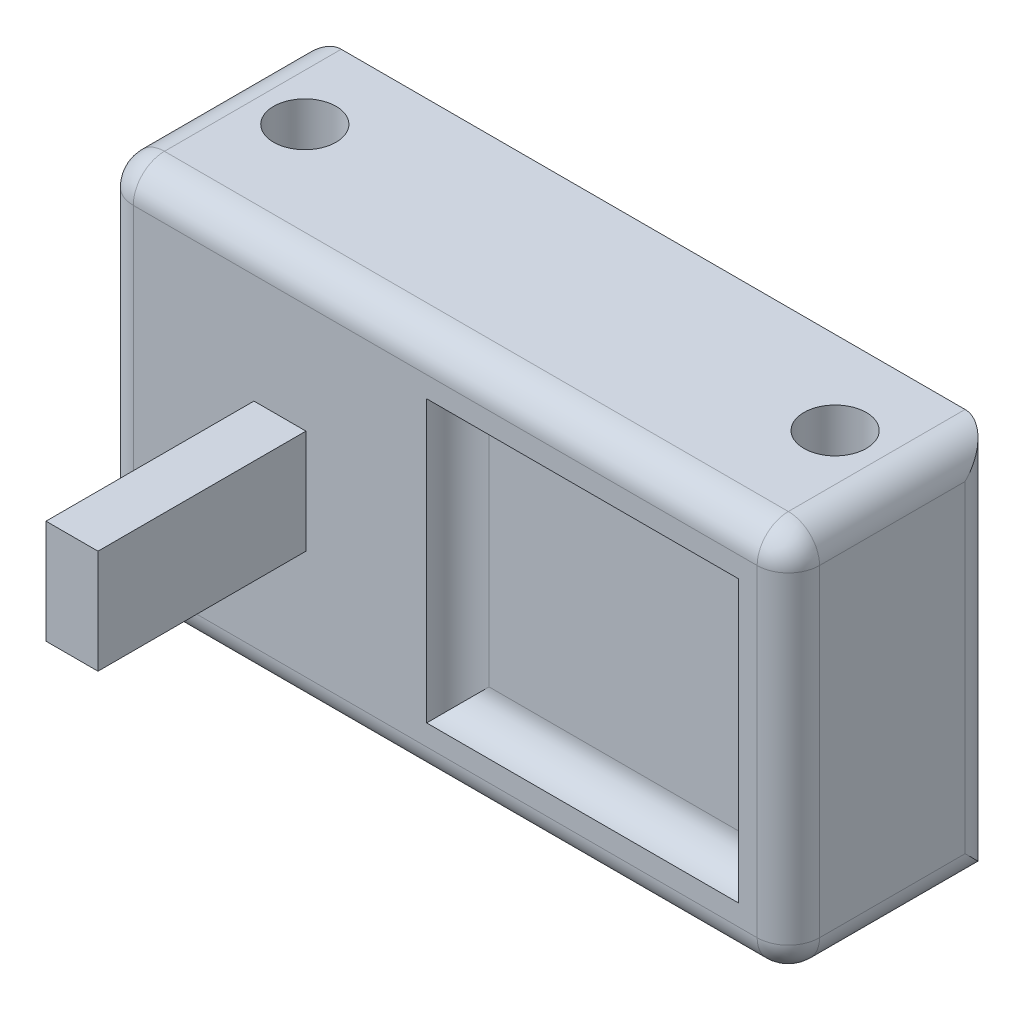
ISO-10303-21;
HEADER;
FILE_DESCRIPTION(('STEP AP214'),'2;1');
FILE_NAME('part.step','',(''),(''),'','','');
FILE_SCHEMA(('AUTOMOTIVE_DESIGN { 1 0 10303 214 1 1 1 1 }'));
ENDSEC;
DATA;
#1=APPLICATION_CONTEXT('core data for automotive mechanical design processes');
#2=APPLICATION_PROTOCOL_DEFINITION('international standard','automotive_design',2000,#1);
#3=PRODUCT_CONTEXT('',#1,'mechanical');
#4=PRODUCT('Part','Part','',(#3));
#5=PRODUCT_RELATED_PRODUCT_CATEGORY('part','',(#4));
#6=PRODUCT_DEFINITION_FORMATION('','',#4);
#7=PRODUCT_DEFINITION_CONTEXT('part definition',#1,'design');
#8=PRODUCT_DEFINITION('design','',#6,#7);
#9=PRODUCT_DEFINITION_SHAPE('','',#8);
#10=(LENGTH_UNIT() NAMED_UNIT(*) SI_UNIT(.MILLI.,.METRE.));
#11=(NAMED_UNIT(*) PLANE_ANGLE_UNIT() SI_UNIT($,.RADIAN.));
#12=(NAMED_UNIT(*) SI_UNIT($,.STERADIAN.) SOLID_ANGLE_UNIT());
#13=UNCERTAINTY_MEASURE_WITH_UNIT(LENGTH_MEASURE(1.E-05),#10,'distance_accuracy_value','');
#14=(GEOMETRIC_REPRESENTATION_CONTEXT(3) GLOBAL_UNCERTAINTY_ASSIGNED_CONTEXT((#13)) GLOBAL_UNIT_ASSIGNED_CONTEXT((#10,
#11,#12)) REPRESENTATION_CONTEXT('',''));
#15=CARTESIAN_POINT('',(0.,0.,0.));
#16=DIRECTION('',(0.,0.,1.));
#17=DIRECTION('',(1.,0.,0.));
#18=AXIS2_PLACEMENT_3D('',#15,#16,#17);
#19=CARTESIAN_POINT('',(0.,0.,200.));
#20=DIRECTION('',(0.,0.,1.));
#21=DIRECTION('',(1.,0.,0.));
#22=AXIS2_PLACEMENT_3D('',#19,#20,#21);
#23=PLANE('',#22);
#24=DIRECTION('',(0.,-1.,0.));
#25=VECTOR('',#24,1.);
#26=CARTESIAN_POINT('',(-66.2823811220889,125.374251497006,200.));
#27=LINE('',#26,#25);
#28=CARTESIAN_POINT('',(-66.2823811220889,125.374251497006,200.));
#29=VERTEX_POINT('',#28);
#30=CARTESIAN_POINT('',(-66.2823811220889,-144.625748502994,200.));
#31=VERTEX_POINT('',#30);
#32=EDGE_CURVE('E195',#29,#31,#27,.T.);
#33=ORIENTED_EDGE('',*,*,#32,.F.);
#34=DIRECTION('',(-1.,0.,0.));
#35=VECTOR('',#34,1.);
#36=CARTESIAN_POINT('',(-66.2823811220889,125.374251497006,200.));
#37=LINE('',#36,#35);
#38=CARTESIAN_POINT('',(233.717618877911,125.374251497006,200.));
#39=VERTEX_POINT('',#38);
#40=EDGE_CURVE('E204',#39,#29,#37,.T.);
#41=ORIENTED_EDGE('',*,*,#40,.F.);
#42=DIRECTION('',(0.,1.,0.));
#43=VECTOR('',#42,1.);
#44=CARTESIAN_POINT('',(233.717618877911,125.374251497006,200.));
#45=LINE('',#44,#43);
#46=CARTESIAN_POINT('',(233.717618877911,-144.625748502994,200.));
#47=VERTEX_POINT('',#46);
#48=EDGE_CURVE('E201',#47,#39,#45,.T.);
#49=ORIENTED_EDGE('',*,*,#48,.F.);
#50=DIRECTION('',(1.,0.,0.));
#51=VECTOR('',#50,1.);
#52=CARTESIAN_POINT('',(-66.2823811220889,-144.625748502994,200.));
#53=LINE('',#52,#51);
#54=EDGE_CURVE('E198',#31,#47,#53,.T.);
#55=ORIENTED_EDGE('',*,*,#54,.F.);
#56=EDGE_LOOP('',(#33,#41,#49,#55));
#57=FACE_BOUND('',#56,.T.);
#58=DIRECTION('',(-1.,0.,0.));
#59=VECTOR('',#58,1.);
#60=CARTESIAN_POINT('',(-378.456705785911,145.374251497006,200.));
#61=LINE('',#60,#59);
#62=CARTESIAN_POINT('',(251.54329421409,145.374251497006,200.));
#63=VERTEX_POINT('',#62);
#64=CARTESIAN_POINT('',(-348.45670578591,145.374251497006,200.));
#65=VERTEX_POINT('',#64);
#66=EDGE_CURVE('E245',#63,#65,#61,.T.);
#67=ORIENTED_EDGE('',*,*,#66,.T.);
#68=DIRECTION('',(0.,-1.,0.));
#69=VECTOR('',#68,1.);
#70=CARTESIAN_POINT('',(-348.45670578591,-194.625748502994,200.));
#71=LINE('',#70,#69);
#72=CARTESIAN_POINT('',(-348.45670578591,-164.625748502994,200.));
#73=VERTEX_POINT('',#72);
#74=EDGE_CURVE('E249',#65,#73,#71,.T.);
#75=ORIENTED_EDGE('',*,*,#74,.T.);
#76=DIRECTION('',(1.,0.,0.));
#77=VECTOR('',#76,1.);
#78=CARTESIAN_POINT('',(281.54329421409,-164.625748502994,200.));
#79=LINE('',#78,#77);
#80=CARTESIAN_POINT('',(251.54329421409,-164.625748502994,200.));
#81=VERTEX_POINT('',#80);
#82=EDGE_CURVE('E247',#73,#81,#79,.T.);
#83=ORIENTED_EDGE('',*,*,#82,.T.);
#84=DIRECTION('',(0.,1.,0.));
#85=VECTOR('',#84,1.);
#86=CARTESIAN_POINT('',(251.54329421409,175.374251497006,200.));
#87=LINE('',#86,#85);
#88=EDGE_CURVE('E243',#81,#63,#87,.T.);
#89=ORIENTED_EDGE('',*,*,#88,.T.);
#90=EDGE_LOOP('',(#67,#75,#83,#89));
#91=FACE_BOUND('',#90,.T.);
#92=DIRECTION('',(-1.,0.,0.));
#93=VECTOR('',#92,1.);
#94=CARTESIAN_POINT('',(-232.369543454,40.3742514970061,200.));
#95=LINE('',#94,#93);
#96=CARTESIAN_POINT('',(-182.369543454,40.3742514970061,200.));
#97=VERTEX_POINT('',#96);
#98=CARTESIAN_POINT('',(-232.369543454,40.3742514970061,200.));
#99=VERTEX_POINT('',#98);
#100=EDGE_CURVE('E683',#97,#99,#95,.T.);
#101=ORIENTED_EDGE('',*,*,#100,.F.);
#102=DIRECTION('',(0.,1.,0.));
#103=VECTOR('',#102,1.);
#104=CARTESIAN_POINT('',(-182.369543454,-59.6257485029939,200.));
#105=LINE('',#104,#103);
#106=CARTESIAN_POINT('',(-182.369543454,-59.6257485029939,200.));
#107=VERTEX_POINT('',#106);
#108=EDGE_CURVE('E186',#107,#97,#105,.T.);
#109=ORIENTED_EDGE('',*,*,#108,.F.);
#110=DIRECTION('',(1.,0.,0.));
#111=VECTOR('',#110,1.);
#112=CARTESIAN_POINT('',(-232.369543454,-59.6257485029939,200.));
#113=LINE('',#112,#111);
#114=CARTESIAN_POINT('',(-232.369543454,-59.6257485029939,200.));
#115=VERTEX_POINT('',#114);
#116=EDGE_CURVE('E182',#115,#107,#113,.T.);
#117=ORIENTED_EDGE('',*,*,#116,.F.);
#118=DIRECTION('',(0.,-1.,0.));
#119=VECTOR('',#118,1.);
#120=CARTESIAN_POINT('',(-232.369543454,-59.6257485029939,200.));
#121=LINE('',#120,#119);
#122=EDGE_CURVE('E685',#99,#115,#121,.T.);
#123=ORIENTED_EDGE('',*,*,#122,.F.);
#124=EDGE_LOOP('',(#101,#109,#117,#123));
#125=FACE_BOUND('',#124,.T.);
#126=ADVANCED_FACE('F37',(#57,#91,#125),#23,.T.);
#127=CARTESIAN_POINT('',(-378.456705785911,175.374251497006,200.));
#128=DIRECTION('',(1.,0.,0.));
#129=DIRECTION('',(0.,1.,0.));
#130=AXIS2_PLACEMENT_3D('',#127,#128,#129);
#131=PLANE('',#130);
#132=DIRECTION('',(0.,-1.,0.));
#133=VECTOR('',#132,1.);
#134=CARTESIAN_POINT('',(-378.456705785911,175.374251497006,170.));
#135=LINE('',#134,#133);
#136=CARTESIAN_POINT('',(-378.45670578591,-164.625748502994,170.));
#137=VERTEX_POINT('',#136);
#138=CARTESIAN_POINT('',(-378.456705785911,145.374251497006,170.));
#139=VERTEX_POINT('',#138);
#140=EDGE_CURVE('E231',#137,#139,#135,.F.);
#141=ORIENTED_EDGE('',*,*,#140,.T.);
#142=DIRECTION('',(0.,0.,-1.));
#143=VECTOR('',#142,1.);
#144=CARTESIAN_POINT('',(-378.456705785911,145.374251497006,200.));
#145=LINE('',#144,#143);
#146=CARTESIAN_POINT('',(-378.456705785911,145.374251497006,30.));
#147=VERTEX_POINT('',#146);
#148=EDGE_CURVE('E233',#139,#147,#145,.T.);
#149=ORIENTED_EDGE('',*,*,#148,.T.);
#150=DIRECTION('',(0.,-1.,0.));
#151=VECTOR('',#150,1.);
#152=CARTESIAN_POINT('',(-378.456705785911,175.374251497006,30.));
#153=LINE('',#152,#151);
#154=CARTESIAN_POINT('',(-378.45670578591,-164.625748502994,30.));
#155=VERTEX_POINT('',#154);
#156=EDGE_CURVE('E227',#147,#155,#153,.T.);
#157=ORIENTED_EDGE('',*,*,#156,.T.);
#158=DIRECTION('',(0.,0.,-1.));
#159=VECTOR('',#158,1.);
#160=CARTESIAN_POINT('',(-378.45670578591,-164.625748502994,200.));
#161=LINE('',#160,#159);
#162=EDGE_CURVE('E229',#155,#137,#161,.F.);
#163=ORIENTED_EDGE('',*,*,#162,.T.);
#164=EDGE_LOOP('',(#141,#149,#157,#163));
#165=FACE_BOUND('',#164,.T.);
#166=ADVANCED_FACE('F352',(#165),#131,.F.);
#167=CARTESIAN_POINT('',(-378.45670578591,-194.625748502994,200.));
#168=DIRECTION('',(0.,1.,0.));
#169=DIRECTION('',(0.,0.,1.));
#170=AXIS2_PLACEMENT_3D('',#167,#168,#169);
#171=PLANE('',#170);
#172=CARTESIAN_POINT('',(-303.45670578591,-194.625748502994,80.));
#173=DIRECTION('',(0.,-1.,0.));
#174=DIRECTION('',(0.,0.,-1.));
#175=AXIS2_PLACEMENT_3D('',#172,#173,#174);
#176=CIRCLE('',#175,30.);
#177=CARTESIAN_POINT('',(-303.45670578591,-194.625748502994,50.));
#178=VERTEX_POINT('',#177);
#179=EDGE_CURVE('E212',#178,#178,#176,.T.);
#180=ORIENTED_EDGE('',*,*,#179,.F.);
#181=EDGE_LOOP('',(#180));
#182=FACE_BOUND('',#181,.T.);
#183=CARTESIAN_POINT('',(206.54329421409,-194.625748502994,80.));
#184=DIRECTION('',(0.,-1.,0.));
#185=DIRECTION('',(0.,0.,-1.));
#186=AXIS2_PLACEMENT_3D('',#183,#184,#185);
#187=CIRCLE('',#186,30.);
#188=CARTESIAN_POINT('',(206.54329421409,-194.625748502994,50.));
#189=VERTEX_POINT('',#188);
#190=EDGE_CURVE('E218',#189,#189,#187,.T.);
#191=ORIENTED_EDGE('',*,*,#190,.F.);
#192=EDGE_LOOP('',(#191));
#193=FACE_BOUND('',#192,.T.);
#194=DIRECTION('',(1.,0.,0.));
#195=VECTOR('',#194,1.);
#196=CARTESIAN_POINT('',(-378.45670578591,-194.625748502994,170.));
#197=LINE('',#196,#195);
#198=CARTESIAN_POINT('',(251.54329421409,-194.625748502994,170.));
#199=VERTEX_POINT('',#198);
#200=CARTESIAN_POINT('',(-348.45670578591,-194.625748502994,170.));
#201=VERTEX_POINT('',#200);
#202=EDGE_CURVE('E252',#199,#201,#197,.F.);
#203=ORIENTED_EDGE('',*,*,#202,.T.);
#204=DIRECTION('',(0.,0.,-1.));
#205=VECTOR('',#204,1.);
#206=CARTESIAN_POINT('',(-348.45670578591,-194.625748502994,200.));
#207=LINE('',#206,#205);
#208=CARTESIAN_POINT('',(-348.45670578591,-194.625748502994,0.));
#209=VERTEX_POINT('',#208);
#210=EDGE_CURVE('E256',#201,#209,#207,.T.);
#211=ORIENTED_EDGE('',*,*,#210,.T.);
#212=DIRECTION('',(1.,0.,0.));
#213=VECTOR('',#212,1.);
#214=CARTESIAN_POINT('',(-378.45670578591,-194.625748502994,0.));
#215=LINE('',#214,#213);
#216=CARTESIAN_POINT('',(251.54329421409,-194.625748502994,0.));
#217=VERTEX_POINT('',#216);
#218=EDGE_CURVE('E211',#209,#217,#215,.T.);
#219=ORIENTED_EDGE('',*,*,#218,.T.);
#220=DIRECTION('',(0.,0.,-1.));
#221=VECTOR('',#220,1.);
#222=CARTESIAN_POINT('',(251.54329421409,-194.625748502994,200.));
#223=LINE('',#222,#221);
#224=EDGE_CURVE('E254',#217,#199,#223,.F.);
#225=ORIENTED_EDGE('',*,*,#224,.T.);
#226=EDGE_LOOP('',(#203,#211,#219,#225));
#227=FACE_BOUND('',#226,.T.);
#228=ADVANCED_FACE('F357',(#182,#193,#227),#171,.F.);
#229=CARTESIAN_POINT('',(281.54329421409,175.374251497006,200.));
#230=DIRECTION('',(-1.,0.,0.));
#231=DIRECTION('',(0.,0.,1.));
#232=AXIS2_PLACEMENT_3D('',#229,#230,#231);
#233=PLANE('',#232);
#234=DIRECTION('',(0.,0.,-1.));
#235=VECTOR('',#234,1.);
#236=CARTESIAN_POINT('',(281.54329421409,-164.625748502994,200.));
#237=LINE('',#236,#235);
#238=CARTESIAN_POINT('',(281.54329421409,-164.625748502994,170.));
#239=VERTEX_POINT('',#238);
#240=CARTESIAN_POINT('',(281.54329421409,-164.625748502994,30.));
#241=VERTEX_POINT('',#240);
#242=EDGE_CURVE('E266',#239,#241,#237,.T.);
#243=ORIENTED_EDGE('',*,*,#242,.T.);
#244=DIRECTION('',(0.,1.,0.));
#245=VECTOR('',#244,1.);
#246=CARTESIAN_POINT('',(281.54329421409,175.374251497006,30.));
#247=LINE('',#246,#245);
#248=CARTESIAN_POINT('',(281.54329421409,145.374251497006,30.));
#249=VERTEX_POINT('',#248);
#250=EDGE_CURVE('E269',#241,#249,#247,.T.);
#251=ORIENTED_EDGE('',*,*,#250,.T.);
#252=DIRECTION('',(0.,0.,-1.));
#253=VECTOR('',#252,1.);
#254=CARTESIAN_POINT('',(281.54329421409,145.374251497006,200.));
#255=LINE('',#254,#253);
#256=CARTESIAN_POINT('',(281.54329421409,145.374251497006,170.));
#257=VERTEX_POINT('',#256);
#258=EDGE_CURVE('E264',#249,#257,#255,.F.);
#259=ORIENTED_EDGE('',*,*,#258,.T.);
#260=DIRECTION('',(0.,1.,0.));
#261=VECTOR('',#260,1.);
#262=CARTESIAN_POINT('',(281.54329421409,-194.625748502994,170.));
#263=LINE('',#262,#261);
#264=EDGE_CURVE('E262',#257,#239,#263,.F.);
#265=ORIENTED_EDGE('',*,*,#264,.T.);
#266=EDGE_LOOP('',(#243,#251,#259,#265));
#267=FACE_BOUND('',#266,.T.);
#268=ADVANCED_FACE('F370',(#267),#233,.F.);
#269=CARTESIAN_POINT('',(-378.456705785911,175.374251497006,200.));
#270=DIRECTION('',(0.,-1.,0.));
#271=DIRECTION('',(0.,0.,-1.));
#272=AXIS2_PLACEMENT_3D('',#269,#270,#271);
#273=PLANE('',#272);
#274=DIRECTION('',(-1.,0.,0.));
#275=VECTOR('',#274,1.);
#276=CARTESIAN_POINT('',(-378.456705785911,175.374251497006,0.));
#277=LINE('',#276,#275);
#278=CARTESIAN_POINT('',(251.54329421409,175.374251497006,0.));
#279=VERTEX_POINT('',#278);
#280=CARTESIAN_POINT('',(-348.45670578591,175.374251497006,0.));
#281=VERTEX_POINT('',#280);
#282=EDGE_CURVE('E224',#279,#281,#277,.T.);
#283=ORIENTED_EDGE('',*,*,#282,.T.);
#284=DIRECTION('',(0.,0.,-1.));
#285=VECTOR('',#284,1.);
#286=CARTESIAN_POINT('',(-348.45670578591,175.374251497006,200.));
#287=LINE('',#286,#285);
#288=CARTESIAN_POINT('',(-348.45670578591,175.374251497006,170.));
#289=VERTEX_POINT('',#288);
#290=EDGE_CURVE('E240',#281,#289,#287,.F.);
#291=ORIENTED_EDGE('',*,*,#290,.T.);
#292=DIRECTION('',(-1.,0.,0.));
#293=VECTOR('',#292,1.);
#294=CARTESIAN_POINT('',(281.54329421409,175.374251497006,170.));
#295=LINE('',#294,#293);
#296=CARTESIAN_POINT('',(251.54329421409,175.374251497006,170.));
#297=VERTEX_POINT('',#296);
#298=EDGE_CURVE('E236',#289,#297,#295,.F.);
#299=ORIENTED_EDGE('',*,*,#298,.T.);
#300=DIRECTION('',(0.,0.,-1.));
#301=VECTOR('',#300,1.);
#302=CARTESIAN_POINT('',(251.54329421409,175.374251497006,200.));
#303=LINE('',#302,#301);
#304=EDGE_CURVE('E238',#297,#279,#303,.T.);
#305=ORIENTED_EDGE('',*,*,#304,.T.);
#306=EDGE_LOOP('',(#283,#291,#299,#305));
#307=FACE_BOUND('',#306,.T.);
#308=CARTESIAN_POINT('',(-303.45670578591,175.374251497006,80.));
#309=DIRECTION('',(0.,-1.,0.));
#310=DIRECTION('',(0.,0.,-1.));
#311=AXIS2_PLACEMENT_3D('',#308,#309,#310);
#312=CIRCLE('',#311,30.);
#313=CARTESIAN_POINT('',(-303.45670578591,175.374251497006,50.));
#314=VERTEX_POINT('',#313);
#315=EDGE_CURVE('E208',#314,#314,#312,.T.);
#316=ORIENTED_EDGE('',*,*,#315,.T.);
#317=EDGE_LOOP('',(#316));
#318=FACE_BOUND('',#317,.T.);
#319=CARTESIAN_POINT('',(206.54329421409,175.374251497006,80.));
#320=DIRECTION('',(0.,-1.,0.));
#321=DIRECTION('',(0.,0.,-1.));
#322=AXIS2_PLACEMENT_3D('',#319,#320,#321);
#323=CIRCLE('',#322,30.);
#324=CARTESIAN_POINT('',(206.54329421409,175.374251497006,50.));
#325=VERTEX_POINT('',#324);
#326=EDGE_CURVE('E215',#325,#325,#323,.T.);
#327=ORIENTED_EDGE('',*,*,#326,.T.);
#328=EDGE_LOOP('',(#327));
#329=FACE_BOUND('',#328,.T.);
#330=ADVANCED_FACE('F366',(#307,#318,#329),#273,.F.);
#331=CARTESIAN_POINT('',(0.,0.,0.));
#332=DIRECTION('',(0.,0.,1.));
#333=DIRECTION('',(1.,0.,0.));
#334=AXIS2_PLACEMENT_3D('',#331,#332,#333);
#335=PLANE('',#334);
#336=ORIENTED_EDGE('',*,*,#218,.F.);
#337=DIRECTION('',(0.,-1.,0.));
#338=VECTOR('',#337,1.);
#339=CARTESIAN_POINT('',(-348.45670578591,-1.04558015634744E-13,0.));
#340=LINE('',#339,#338);
#341=EDGE_CURVE('E260',#209,#281,#340,.F.);
#342=ORIENTED_EDGE('',*,*,#341,.T.);
#343=ORIENTED_EDGE('',*,*,#282,.F.);
#344=DIRECTION('',(0.,1.,0.));
#345=VECTOR('',#344,1.);
#346=CARTESIAN_POINT('',(251.54329421409,0.,0.));
#347=LINE('',#346,#345);
#348=EDGE_CURVE('E258',#279,#217,#347,.F.);
#349=ORIENTED_EDGE('',*,*,#348,.T.);
#350=EDGE_LOOP('',(#336,#342,#343,#349));
#351=FACE_BOUND('',#350,.T.);
#352=ADVANCED_FACE('F363',(#351),#335,.F.);
#353=CARTESIAN_POINT('',(206.54329421409,175.374251497006,80.));
#354=DIRECTION('',(0.,-1.,0.));
#355=DIRECTION('',(0.,0.,-1.));
#356=AXIS2_PLACEMENT_3D('',#353,#354,#355);
#357=CYLINDRICAL_SURFACE('',#356,30.);
#358=ORIENTED_EDGE('',*,*,#326,.F.);
#359=EDGE_LOOP('',(#358));
#360=FACE_BOUND('',#359,.T.);
#361=ORIENTED_EDGE('',*,*,#190,.T.);
#362=EDGE_LOOP('',(#361));
#363=FACE_BOUND('',#362,.T.);
#364=ADVANCED_FACE('F362',(#360,#363),#357,.F.);
#365=CARTESIAN_POINT('',(-303.45670578591,175.374251497006,80.));
#366=DIRECTION('',(0.,-1.,0.));
#367=DIRECTION('',(0.,0.,-1.));
#368=AXIS2_PLACEMENT_3D('',#365,#366,#367);
#369=CYLINDRICAL_SURFACE('',#368,30.);
#370=ORIENTED_EDGE('',*,*,#315,.F.);
#371=EDGE_LOOP('',(#370));
#372=FACE_BOUND('',#371,.T.);
#373=ORIENTED_EDGE('',*,*,#179,.T.);
#374=EDGE_LOOP('',(#373));
#375=FACE_BOUND('',#374,.T.);
#376=ADVANCED_FACE('F428',(#372,#375),#369,.F.);
#377=CARTESIAN_POINT('',(251.54329421409,-164.625748502994,200.));
#378=DIRECTION('',(0.,0.,-1.));
#379=DIRECTION('',(-1.,0.,0.));
#380=AXIS2_PLACEMENT_3D('',#377,#378,#379);
#381=CYLINDRICAL_SURFACE('',#380,30.);
#382=CARTESIAN_POINT('',(251.54329421409,-164.625748502994,170.));
#383=DIRECTION('',(0.,0.,1.));
#384=DIRECTION('',(1.,0.,0.));
#385=AXIS2_PLACEMENT_3D('',#382,#383,#384);
#386=CIRCLE('',#385,30.);
#387=EDGE_CURVE('E310',#199,#239,#386,.T.);
#388=ORIENTED_EDGE('',*,*,#387,.F.);
#389=ORIENTED_EDGE('',*,*,#224,.F.);
#390=CARTESIAN_POINT('',(251.54329421409,-164.625748502994,30.));
#391=DIRECTION('',(0.,0.707106781186547,-0.707106781186547));
#392=DIRECTION('',(0.,0.707106781186547,0.707106781186547));
#393=AXIS2_PLACEMENT_3D('',#390,#391,#392);
#394=ELLIPSE('',#393,42.4264068711928,30.);
#395=EDGE_CURVE('E221',#241,#217,#394,.T.);
#396=ORIENTED_EDGE('',*,*,#395,.F.);
#397=ORIENTED_EDGE('',*,*,#242,.F.);
#398=EDGE_LOOP('',(#388,#389,#396,#397));
#399=FACE_BOUND('',#398,.T.);
#400=ADVANCED_FACE('F424',(#399),#381,.T.);
#401=CARTESIAN_POINT('',(251.54329421409,175.374251497006,30.));
#402=DIRECTION('',(0.,1.,0.));
#403=DIRECTION('',(0.,0.,1.));
#404=AXIS2_PLACEMENT_3D('',#401,#402,#403);
#405=CYLINDRICAL_SURFACE('',#404,30.);
#406=ORIENTED_EDGE('',*,*,#395,.T.);
#407=ORIENTED_EDGE('',*,*,#348,.F.);
#408=CARTESIAN_POINT('',(251.54329421409,145.374251497006,30.));
#409=DIRECTION('',(0.,0.707106781186547,0.707106781186547));
#410=DIRECTION('',(0.,0.707106781186547,-0.707106781186547));
#411=AXIS2_PLACEMENT_3D('',#408,#409,#410);
#412=ELLIPSE('',#411,42.4264068711928,30.);
#413=EDGE_CURVE('E307',#249,#279,#412,.T.);
#414=ORIENTED_EDGE('',*,*,#413,.F.);
#415=ORIENTED_EDGE('',*,*,#250,.F.);
#416=EDGE_LOOP('',(#406,#407,#414,#415));
#417=FACE_BOUND('',#416,.T.);
#418=ADVANCED_FACE('F420',(#417),#405,.T.);
#419=CARTESIAN_POINT('',(251.54329421409,-164.625748502994,170.));
#420=DIRECTION('',(0.,0.,1.));
#421=DIRECTION('',(1.,0.,0.));
#422=AXIS2_PLACEMENT_3D('',#419,#420,#421);
#423=SPHERICAL_SURFACE('',#422,30.);
#424=CARTESIAN_POINT('',(251.54329421409,-164.625748502994,170.));
#425=DIRECTION('',(1.,0.,0.));
#426=DIRECTION('',(0.,0.,-1.));
#427=AXIS2_PLACEMENT_3D('',#424,#425,#426);
#428=CIRCLE('',#427,30.);
#429=EDGE_CURVE('E301',#199,#81,#428,.F.);
#430=ORIENTED_EDGE('',*,*,#429,.F.);
#431=ORIENTED_EDGE('',*,*,#387,.T.);
#432=CARTESIAN_POINT('',(251.54329421409,-164.625748502994,170.));
#433=DIRECTION('',(0.,-1.,0.));
#434=DIRECTION('',(0.,0.,-1.));
#435=AXIS2_PLACEMENT_3D('',#432,#433,#434);
#436=CIRCLE('',#435,30.);
#437=EDGE_CURVE('E304',#81,#239,#436,.F.);
#438=ORIENTED_EDGE('',*,*,#437,.F.);
#439=EDGE_LOOP('',(#430,#431,#438));
#440=FACE_BOUND('',#439,.T.);
#441=ADVANCED_FACE('F416',(#440),#423,.T.);
#442=CARTESIAN_POINT('',(251.54329421409,145.374251497006,200.));
#443=DIRECTION('',(0.,0.,-1.));
#444=DIRECTION('',(-1.,0.,0.));
#445=AXIS2_PLACEMENT_3D('',#442,#443,#444);
#446=CYLINDRICAL_SURFACE('',#445,30.);
#447=ORIENTED_EDGE('',*,*,#413,.T.);
#448=ORIENTED_EDGE('',*,*,#304,.F.);
#449=CARTESIAN_POINT('',(251.54329421409,145.374251497006,170.));
#450=DIRECTION('',(0.,0.,1.));
#451=DIRECTION('',(1.,0.,0.));
#452=AXIS2_PLACEMENT_3D('',#449,#450,#451);
#453=CIRCLE('',#452,30.);
#454=EDGE_CURVE('E298',#257,#297,#453,.T.);
#455=ORIENTED_EDGE('',*,*,#454,.F.);
#456=ORIENTED_EDGE('',*,*,#258,.F.);
#457=EDGE_LOOP('',(#447,#448,#455,#456));
#458=FACE_BOUND('',#457,.T.);
#459=ADVANCED_FACE('F412',(#458),#446,.T.);
#460=CARTESIAN_POINT('',(251.54329421409,0.,170.));
#461=DIRECTION('',(0.,-1.,0.));
#462=DIRECTION('',(0.,0.,-1.));
#463=AXIS2_PLACEMENT_3D('',#460,#461,#462);
#464=CYLINDRICAL_SURFACE('',#463,30.);
#465=ORIENTED_EDGE('',*,*,#437,.T.);
#466=ORIENTED_EDGE('',*,*,#264,.F.);
#467=CARTESIAN_POINT('',(251.54329421409,145.374251497006,170.));
#468=DIRECTION('',(0.,1.,0.));
#469=DIRECTION('',(0.,0.,1.));
#470=AXIS2_PLACEMENT_3D('',#467,#468,#469);
#471=CIRCLE('',#470,30.);
#472=EDGE_CURVE('E295',#63,#257,#471,.T.);
#473=ORIENTED_EDGE('',*,*,#472,.F.);
#474=ORIENTED_EDGE('',*,*,#88,.F.);
#475=EDGE_LOOP('',(#465,#466,#473,#474));
#476=FACE_BOUND('',#475,.T.);
#477=ADVANCED_FACE('F408',(#476),#464,.T.);
#478=CARTESIAN_POINT('',(0.,-164.625748502994,170.));
#479=DIRECTION('',(-1.,0.,0.));
#480=DIRECTION('',(0.,0.,1.));
#481=AXIS2_PLACEMENT_3D('',#478,#479,#480);
#482=CYLINDRICAL_SURFACE('',#481,30.);
#483=ORIENTED_EDGE('',*,*,#429,.T.);
#484=ORIENTED_EDGE('',*,*,#82,.F.);
#485=CARTESIAN_POINT('',(-348.45670578591,-164.625748502994,170.));
#486=DIRECTION('',(-1.,0.,0.));
#487=DIRECTION('',(0.,0.,1.));
#488=AXIS2_PLACEMENT_3D('',#485,#486,#487);
#489=CIRCLE('',#488,30.);
#490=EDGE_CURVE('E292',#201,#73,#489,.T.);
#491=ORIENTED_EDGE('',*,*,#490,.F.);
#492=ORIENTED_EDGE('',*,*,#202,.F.);
#493=EDGE_LOOP('',(#483,#484,#491,#492));
#494=FACE_BOUND('',#493,.T.);
#495=ADVANCED_FACE('F404',(#494),#482,.T.);
#496=CARTESIAN_POINT('',(251.54329421409,145.374251497006,170.));
#497=DIRECTION('',(0.,0.,1.));
#498=DIRECTION('',(1.,0.,0.));
#499=AXIS2_PLACEMENT_3D('',#496,#497,#498);
#500=SPHERICAL_SURFACE('',#499,30.);
#501=ORIENTED_EDGE('',*,*,#472,.T.);
#502=ORIENTED_EDGE('',*,*,#454,.T.);
#503=CARTESIAN_POINT('',(251.54329421409,145.374251497006,170.));
#504=DIRECTION('',(1.,0.,0.));
#505=DIRECTION('',(0.,0.,-1.));
#506=AXIS2_PLACEMENT_3D('',#503,#504,#505);
#507=CIRCLE('',#506,30.);
#508=EDGE_CURVE('E289',#63,#297,#507,.F.);
#509=ORIENTED_EDGE('',*,*,#508,.F.);
#510=EDGE_LOOP('',(#501,#502,#509));
#511=FACE_BOUND('',#510,.T.);
#512=ADVANCED_FACE('F400',(#511),#500,.T.);
#513=CARTESIAN_POINT('',(-348.45670578591,-164.625748502994,170.));
#514=DIRECTION('',(0.,0.,1.));
#515=DIRECTION('',(1.,0.,0.));
#516=AXIS2_PLACEMENT_3D('',#513,#514,#515);
#517=SPHERICAL_SURFACE('',#516,30.);
#518=CARTESIAN_POINT('',(-348.45670578591,-164.625748502994,170.));
#519=DIRECTION('',(0.,0.,1.));
#520=DIRECTION('',(1.,0.,0.));
#521=AXIS2_PLACEMENT_3D('',#518,#519,#520);
#522=CIRCLE('',#521,30.);
#523=EDGE_CURVE('E284',#201,#137,#522,.F.);
#524=ORIENTED_EDGE('',*,*,#523,.F.);
#525=ORIENTED_EDGE('',*,*,#490,.T.);
#526=CARTESIAN_POINT('',(-348.45670578591,-164.625748502994,170.));
#527=DIRECTION('',(0.,-1.,0.));
#528=DIRECTION('',(0.,0.,-1.));
#529=AXIS2_PLACEMENT_3D('',#526,#527,#528);
#530=CIRCLE('',#529,30.);
#531=EDGE_CURVE('E287',#137,#73,#530,.F.);
#532=ORIENTED_EDGE('',*,*,#531,.F.);
#533=EDGE_LOOP('',(#524,#525,#532));
#534=FACE_BOUND('',#533,.T.);
#535=ADVANCED_FACE('F396',(#534),#517,.T.);
#536=CARTESIAN_POINT('',(0.,145.374251497006,170.));
#537=DIRECTION('',(1.,0.,0.));
#538=DIRECTION('',(0.,0.,-1.));
#539=AXIS2_PLACEMENT_3D('',#536,#537,#538);
#540=CYLINDRICAL_SURFACE('',#539,30.);
#541=ORIENTED_EDGE('',*,*,#508,.T.);
#542=ORIENTED_EDGE('',*,*,#298,.F.);
#543=CARTESIAN_POINT('',(-348.45670578591,145.374251497006,170.));
#544=DIRECTION('',(-1.,0.,0.));
#545=DIRECTION('',(0.,0.,1.));
#546=AXIS2_PLACEMENT_3D('',#543,#544,#545);
#547=CIRCLE('',#546,30.);
#548=EDGE_CURVE('E281',#65,#289,#547,.T.);
#549=ORIENTED_EDGE('',*,*,#548,.F.);
#550=ORIENTED_EDGE('',*,*,#66,.F.);
#551=EDGE_LOOP('',(#541,#542,#549,#550));
#552=FACE_BOUND('',#551,.T.);
#553=ADVANCED_FACE('F392',(#552),#540,.T.);
#554=CARTESIAN_POINT('',(-348.45670578591,-1.04558015634744E-13,170.));
#555=DIRECTION('',(0.,1.,0.));
#556=DIRECTION('',(-1.,0.,0.));
#557=AXIS2_PLACEMENT_3D('',#554,#555,#556);
#558=CYLINDRICAL_SURFACE('',#557,30.);
#559=ORIENTED_EDGE('',*,*,#531,.T.);
#560=ORIENTED_EDGE('',*,*,#74,.F.);
#561=CARTESIAN_POINT('',(-348.45670578591,145.374251497006,170.));
#562=DIRECTION('',(0.,1.,0.));
#563=DIRECTION('',(0.,0.,1.));
#564=AXIS2_PLACEMENT_3D('',#561,#562,#563);
#565=CIRCLE('',#564,30.);
#566=EDGE_CURVE('E278',#139,#65,#565,.T.);
#567=ORIENTED_EDGE('',*,*,#566,.F.);
#568=ORIENTED_EDGE('',*,*,#140,.F.);
#569=EDGE_LOOP('',(#559,#560,#567,#568));
#570=FACE_BOUND('',#569,.T.);
#571=ADVANCED_FACE('F388',(#570),#558,.T.);
#572=CARTESIAN_POINT('',(-348.45670578591,-164.625748502994,200.));
#573=DIRECTION('',(0.,0.,-1.));
#574=DIRECTION('',(-1.,0.,0.));
#575=AXIS2_PLACEMENT_3D('',#572,#573,#574);
#576=CYLINDRICAL_SURFACE('',#575,30.);
#577=ORIENTED_EDGE('',*,*,#523,.T.);
#578=ORIENTED_EDGE('',*,*,#162,.F.);
#579=CARTESIAN_POINT('',(-348.45670578591,-164.625748502994,30.));
#580=DIRECTION('',(0.,-0.707106781186547,0.707106781186547));
#581=DIRECTION('',(0.,-0.707106781186547,-0.707106781186547));
#582=AXIS2_PLACEMENT_3D('',#579,#580,#581);
#583=ELLIPSE('',#582,42.4264068711928,30.);
#584=EDGE_CURVE('E275',#209,#155,#583,.F.);
#585=ORIENTED_EDGE('',*,*,#584,.F.);
#586=ORIENTED_EDGE('',*,*,#210,.F.);
#587=EDGE_LOOP('',(#577,#578,#585,#586));
#588=FACE_BOUND('',#587,.T.);
#589=ADVANCED_FACE('F384',(#588),#576,.T.);
#590=CARTESIAN_POINT('',(-348.45670578591,145.374251497006,170.));
#591=DIRECTION('',(0.,0.,1.));
#592=DIRECTION('',(1.,0.,0.));
#593=AXIS2_PLACEMENT_3D('',#590,#591,#592);
#594=SPHERICAL_SURFACE('',#593,30.);
#595=ORIENTED_EDGE('',*,*,#566,.T.);
#596=ORIENTED_EDGE('',*,*,#548,.T.);
#597=CARTESIAN_POINT('',(-348.45670578591,145.374251497006,170.));
#598=DIRECTION('',(0.,0.,1.));
#599=DIRECTION('',(1.,0.,0.));
#600=AXIS2_PLACEMENT_3D('',#597,#598,#599);
#601=CIRCLE('',#600,30.);
#602=EDGE_CURVE('E273',#139,#289,#601,.F.);
#603=ORIENTED_EDGE('',*,*,#602,.F.);
#604=EDGE_LOOP('',(#595,#596,#603));
#605=FACE_BOUND('',#604,.T.);
#606=ADVANCED_FACE('F380',(#605),#594,.T.);
#607=CARTESIAN_POINT('',(-348.45670578591,175.374251497006,30.));
#608=DIRECTION('',(0.,-1.,0.));
#609=DIRECTION('',(1.,0.,0.));
#610=AXIS2_PLACEMENT_3D('',#607,#608,#609);
#611=CYLINDRICAL_SURFACE('',#610,30.);
#612=ORIENTED_EDGE('',*,*,#584,.T.);
#613=ORIENTED_EDGE('',*,*,#156,.F.);
#614=CARTESIAN_POINT('',(-348.45670578591,145.374251497006,30.));
#615=DIRECTION('',(0.,-0.707106781186547,-0.707106781186547));
#616=DIRECTION('',(0.,-0.707106781186547,0.707106781186547));
#617=AXIS2_PLACEMENT_3D('',#614,#615,#616);
#618=ELLIPSE('',#617,42.4264068711928,30.);
#619=EDGE_CURVE('E207',#281,#147,#618,.F.);
#620=ORIENTED_EDGE('',*,*,#619,.F.);
#621=ORIENTED_EDGE('',*,*,#341,.F.);
#622=EDGE_LOOP('',(#612,#613,#620,#621));
#623=FACE_BOUND('',#622,.T.);
#624=ADVANCED_FACE('F346',(#623),#611,.T.);
#625=CARTESIAN_POINT('',(-348.45670578591,145.374251497006,200.));
#626=DIRECTION('',(0.,0.,-1.));
#627=DIRECTION('',(-1.,0.,0.));
#628=AXIS2_PLACEMENT_3D('',#625,#626,#627);
#629=CYLINDRICAL_SURFACE('',#628,30.);
#630=ORIENTED_EDGE('',*,*,#602,.T.);
#631=ORIENTED_EDGE('',*,*,#290,.F.);
#632=ORIENTED_EDGE('',*,*,#619,.T.);
#633=ORIENTED_EDGE('',*,*,#148,.F.);
#634=EDGE_LOOP('',(#630,#631,#632,#633));
#635=FACE_BOUND('',#634,.T.);
#636=ADVANCED_FACE('F340',(#635),#629,.T.);
#637=CARTESIAN_POINT('',(0.,0.,170.));
#638=DIRECTION('',(0.,0.,1.));
#639=DIRECTION('',(1.,0.,0.));
#640=AXIS2_PLACEMENT_3D('',#637,#638,#639);
#641=PLANE('',#640);
#642=DIRECTION('',(1.,0.,0.));
#643=VECTOR('',#642,1.);
#644=CARTESIAN_POINT('',(0.,-114.625748502994,170.));
#645=LINE('',#644,#643);
#646=CARTESIAN_POINT('',(-36.2823811220889,-114.625748502994,170.));
#647=VERTEX_POINT('',#646);
#648=CARTESIAN_POINT('',(203.717618877911,-114.625748502994,170.));
#649=VERTEX_POINT('',#648);
#650=EDGE_CURVE('E46',#647,#649,#645,.T.);
#651=ORIENTED_EDGE('',*,*,#650,.T.);
#652=DIRECTION('',(0.,1.,0.));
#653=VECTOR('',#652,1.);
#654=CARTESIAN_POINT('',(203.717618877911,0.,170.));
#655=LINE('',#654,#653);
#656=CARTESIAN_POINT('',(203.717618877911,95.3742514970061,170.));
#657=VERTEX_POINT('',#656);
#658=EDGE_CURVE('E11',#649,#657,#655,.T.);
#659=ORIENTED_EDGE('',*,*,#658,.T.);
#660=DIRECTION('',(-1.,0.,0.));
#661=VECTOR('',#660,1.);
#662=CARTESIAN_POINT('',(0.,95.3742514970061,170.));
#663=LINE('',#662,#661);
#664=CARTESIAN_POINT('',(-36.2823811220889,95.3742514970061,170.));
#665=VERTEX_POINT('',#664);
#666=EDGE_CURVE('E271',#657,#665,#663,.T.);
#667=ORIENTED_EDGE('',*,*,#666,.T.);
#668=DIRECTION('',(0.,-1.,0.));
#669=VECTOR('',#668,1.);
#670=CARTESIAN_POINT('',(-36.2823811220889,0.,170.));
#671=LINE('',#670,#669);
#672=EDGE_CURVE('E316',#665,#647,#671,.T.);
#673=ORIENTED_EDGE('',*,*,#672,.T.);
#674=EDGE_LOOP('',(#651,#659,#667,#673));
#675=FACE_BOUND('',#674,.T.);
#676=ADVANCED_FACE('F338',(#675),#641,.T.);
#677=CARTESIAN_POINT('',(-36.2823811220889,0.,200.));
#678=DIRECTION('',(0.,-1.,0.));
#679=DIRECTION('',(1.,0.,0.));
#680=AXIS2_PLACEMENT_3D('',#677,#678,#679);
#681=CYLINDRICAL_SURFACE('',#680,30.);
#682=CARTESIAN_POINT('',(-36.2823811220889,95.3742514970061,200.));
#683=DIRECTION('',(-0.707106781186547,-0.707106781186548,0.));
#684=DIRECTION('',(0.707106781186547,-0.707106781186547,0.));
#685=AXIS2_PLACEMENT_3D('',#682,#683,#684);
#686=ELLIPSE('',#685,42.4264068711929,30.);
#687=EDGE_CURVE('E319',#29,#665,#686,.T.);
#688=ORIENTED_EDGE('',*,*,#687,.F.);
#689=ORIENTED_EDGE('',*,*,#32,.T.);
#690=CARTESIAN_POINT('',(-36.2823811220889,-114.625748502994,200.));
#691=DIRECTION('',(0.707106781186547,-0.707106781186547,0.));
#692=DIRECTION('',(0.707106781186547,0.707106781186548,0.));
#693=AXIS2_PLACEMENT_3D('',#690,#691,#692);
#694=ELLIPSE('',#693,42.4264068711928,30.);
#695=EDGE_CURVE('E41',#647,#31,#694,.F.);
#696=ORIENTED_EDGE('',*,*,#695,.F.);
#697=ORIENTED_EDGE('',*,*,#672,.F.);
#698=EDGE_LOOP('',(#688,#689,#696,#697));
#699=FACE_BOUND('',#698,.T.);
#700=ADVANCED_FACE('F39',(#699),#681,.F.);
#701=CARTESIAN_POINT('',(0.,-114.625748502994,200.));
#702=DIRECTION('',(1.,0.,0.));
#703=DIRECTION('',(0.,0.,-1.));
#704=AXIS2_PLACEMENT_3D('',#701,#702,#703);
#705=CYLINDRICAL_SURFACE('',#704,30.);
#706=ORIENTED_EDGE('',*,*,#695,.T.);
#707=ORIENTED_EDGE('',*,*,#54,.T.);
#708=CARTESIAN_POINT('',(203.717618877911,-114.625748502994,200.));
#709=DIRECTION('',(0.707106781186547,0.707106781186548,0.));
#710=DIRECTION('',(-0.707106781186547,0.707106781186547,0.));
#711=AXIS2_PLACEMENT_3D('',#708,#709,#710);
#712=ELLIPSE('',#711,42.4264068711929,30.);
#713=EDGE_CURVE('E190',#649,#47,#712,.F.);
#714=ORIENTED_EDGE('',*,*,#713,.F.);
#715=ORIENTED_EDGE('',*,*,#650,.F.);
#716=EDGE_LOOP('',(#706,#707,#714,#715));
#717=FACE_BOUND('',#716,.T.);
#718=ADVANCED_FACE('F327',(#717),#705,.F.);
#719=CARTESIAN_POINT('',(0.,95.3742514970061,200.));
#720=DIRECTION('',(-1.,0.,0.));
#721=DIRECTION('',(0.,0.,1.));
#722=AXIS2_PLACEMENT_3D('',#719,#720,#721);
#723=CYLINDRICAL_SURFACE('',#722,30.);
#724=ORIENTED_EDGE('',*,*,#687,.T.);
#725=ORIENTED_EDGE('',*,*,#666,.F.);
#726=CARTESIAN_POINT('',(203.717618877911,95.3742514970061,200.));
#727=DIRECTION('',(-0.707106781186547,0.707106781186547,0.));
#728=DIRECTION('',(0.707106781186547,0.707106781186548,0.));
#729=AXIS2_PLACEMENT_3D('',#726,#727,#728);
#730=ELLIPSE('',#729,42.4264068711928,30.);
#731=EDGE_CURVE('E188',#39,#657,#730,.T.);
#732=ORIENTED_EDGE('',*,*,#731,.F.);
#733=ORIENTED_EDGE('',*,*,#40,.T.);
#734=EDGE_LOOP('',(#724,#725,#732,#733));
#735=FACE_BOUND('',#734,.T.);
#736=ADVANCED_FACE('F337',(#735),#723,.F.);
#737=CARTESIAN_POINT('',(203.717618877911,0.,200.));
#738=DIRECTION('',(0.,1.,0.));
#739=DIRECTION('',(-1.,0.,0.));
#740=AXIS2_PLACEMENT_3D('',#737,#738,#739);
#741=CYLINDRICAL_SURFACE('',#740,30.);
#742=ORIENTED_EDGE('',*,*,#713,.T.);
#743=ORIENTED_EDGE('',*,*,#48,.T.);
#744=ORIENTED_EDGE('',*,*,#731,.T.);
#745=ORIENTED_EDGE('',*,*,#658,.F.);
#746=EDGE_LOOP('',(#742,#743,#744,#745));
#747=FACE_BOUND('',#746,.T.);
#748=ADVANCED_FACE('F335',(#747),#741,.F.);
#749=CARTESIAN_POINT('',(-182.369543454,-59.6257485029939,400.));
#750=DIRECTION('',(-1.,0.,0.));
#751=DIRECTION('',(0.,0.,1.));
#752=AXIS2_PLACEMENT_3D('',#749,#750,#751);
#753=PLANE('',#752);
#754=ORIENTED_EDGE('',*,*,#108,.T.);
#755=DIRECTION('',(0.,0.,-1.));
#756=VECTOR('',#755,1.);
#757=CARTESIAN_POINT('',(-182.369543454,40.3742514970061,400.));
#758=LINE('',#757,#756);
#759=CARTESIAN_POINT('',(-182.369543454,40.3742514970061,400.));
#760=VERTEX_POINT('',#759);
#761=EDGE_CURVE('E167',#760,#97,#758,.T.);
#762=ORIENTED_EDGE('',*,*,#761,.F.);
#763=DIRECTION('',(0.,1.,0.));
#764=VECTOR('',#763,1.);
#765=CARTESIAN_POINT('',(-182.369543454,-59.6257485029939,400.));
#766=LINE('',#765,#764);
#767=CARTESIAN_POINT('',(-182.369543454,-59.6257485029939,400.));
#768=VERTEX_POINT('',#767);
#769=EDGE_CURVE('E174',#768,#760,#766,.T.);
#770=ORIENTED_EDGE('',*,*,#769,.F.);
#771=DIRECTION('',(0.,0.,-1.));
#772=VECTOR('',#771,1.);
#773=CARTESIAN_POINT('',(-182.369543454,-59.6257485029939,400.));
#774=LINE('',#773,#772);
#775=EDGE_CURVE('E692',#768,#107,#774,.T.);
#776=ORIENTED_EDGE('',*,*,#775,.T.);
#777=EDGE_LOOP('',(#754,#762,#770,#776));
#778=FACE_BOUND('',#777,.T.);
#779=ADVANCED_FACE('F184',(#778),#753,.F.);
#780=CARTESIAN_POINT('',(-232.369543454,40.3742514970061,400.));
#781=DIRECTION('',(0.,-1.,0.));
#782=DIRECTION('',(0.,0.,-1.));
#783=AXIS2_PLACEMENT_3D('',#780,#781,#782);
#784=PLANE('',#783);
#785=ORIENTED_EDGE('',*,*,#100,.T.);
#786=DIRECTION('',(0.,0.,-1.));
#787=VECTOR('',#786,1.);
#788=CARTESIAN_POINT('',(-232.369543454,40.3742514970061,400.));
#789=LINE('',#788,#787);
#790=CARTESIAN_POINT('',(-232.369543454,40.3742514970061,400.));
#791=VERTEX_POINT('',#790);
#792=EDGE_CURVE('E170',#791,#99,#789,.T.);
#793=ORIENTED_EDGE('',*,*,#792,.F.);
#794=DIRECTION('',(-1.,0.,0.));
#795=VECTOR('',#794,1.);
#796=CARTESIAN_POINT('',(-232.369543454,40.3742514970061,400.));
#797=LINE('',#796,#795);
#798=EDGE_CURVE('E163',#760,#791,#797,.T.);
#799=ORIENTED_EDGE('',*,*,#798,.F.);
#800=ORIENTED_EDGE('',*,*,#761,.T.);
#801=EDGE_LOOP('',(#785,#793,#799,#800));
#802=FACE_BOUND('',#801,.T.);
#803=ADVANCED_FACE('F165',(#802),#784,.F.);
#804=CARTESIAN_POINT('',(-232.369543454,-59.6257485029939,400.));
#805=DIRECTION('',(1.,0.,0.));
#806=DIRECTION('',(0.,0.,-1.));
#807=AXIS2_PLACEMENT_3D('',#804,#805,#806);
#808=PLANE('',#807);
#809=ORIENTED_EDGE('',*,*,#122,.T.);
#810=DIRECTION('',(0.,0.,-1.));
#811=VECTOR('',#810,1.);
#812=CARTESIAN_POINT('',(-232.369543454,-59.6257485029939,400.));
#813=LINE('',#812,#811);
#814=CARTESIAN_POINT('',(-232.369543454,-59.6257485029939,400.));
#815=VERTEX_POINT('',#814);
#816=EDGE_CURVE('E54',#815,#115,#813,.T.);
#817=ORIENTED_EDGE('',*,*,#816,.F.);
#818=DIRECTION('',(0.,-1.,0.));
#819=VECTOR('',#818,1.);
#820=CARTESIAN_POINT('',(-232.369543454,-59.6257485029939,400.));
#821=LINE('',#820,#819);
#822=EDGE_CURVE('E173',#791,#815,#821,.T.);
#823=ORIENTED_EDGE('',*,*,#822,.F.);
#824=ORIENTED_EDGE('',*,*,#792,.T.);
#825=EDGE_LOOP('',(#809,#817,#823,#824));
#826=FACE_BOUND('',#825,.T.);
#827=ADVANCED_FACE('F457',(#826),#808,.F.);
#828=CARTESIAN_POINT('',(-232.369543454,-59.6257485029939,400.));
#829=DIRECTION('',(0.,1.,0.));
#830=DIRECTION('',(0.,0.,1.));
#831=AXIS2_PLACEMENT_3D('',#828,#829,#830);
#832=PLANE('',#831);
#833=ORIENTED_EDGE('',*,*,#116,.T.);
#834=ORIENTED_EDGE('',*,*,#775,.F.);
#835=DIRECTION('',(1.,0.,0.));
#836=VECTOR('',#835,1.);
#837=CARTESIAN_POINT('',(-232.369543454,-59.6257485029939,400.));
#838=LINE('',#837,#836);
#839=EDGE_CURVE('E178',#815,#768,#838,.T.);
#840=ORIENTED_EDGE('',*,*,#839,.F.);
#841=ORIENTED_EDGE('',*,*,#816,.T.);
#842=EDGE_LOOP('',(#833,#834,#840,#841));
#843=FACE_BOUND('',#842,.T.);
#844=ADVANCED_FACE('F464',(#843),#832,.F.);
#845=CARTESIAN_POINT('',(0.,0.,400.));
#846=DIRECTION('',(0.,0.,-1.));
#847=DIRECTION('',(-1.,0.,0.));
#848=AXIS2_PLACEMENT_3D('',#845,#846,#847);
#849=PLANE('',#848);
#850=ORIENTED_EDGE('',*,*,#769,.T.);
#851=ORIENTED_EDGE('',*,*,#798,.T.);
#852=ORIENTED_EDGE('',*,*,#822,.T.);
#853=ORIENTED_EDGE('',*,*,#839,.T.);
#854=EDGE_LOOP('',(#850,#851,#852,#853));
#855=FACE_BOUND('',#854,.T.);
#856=ADVANCED_FACE('F177',(#855),#849,.F.);
#857=CLOSED_SHELL('',(#126,#166,#228,#268,#330,#352,#364,#376,#400,#418,#441,#459,#477,#495,
#512,#535,#553,#571,#589,#606,#624,#636,#676,#700,#718,#736,#748,#779,#803,#827,#844,#856));
#858=MANIFOLD_SOLID_BREP('B2',#857);
#859=ADVANCED_BREP_SHAPE_REPRESENTATION('',(#18,#858),#14);
#860=SHAPE_DEFINITION_REPRESENTATION(#9,#859);
ENDSEC;
END-ISO-10303-21;
